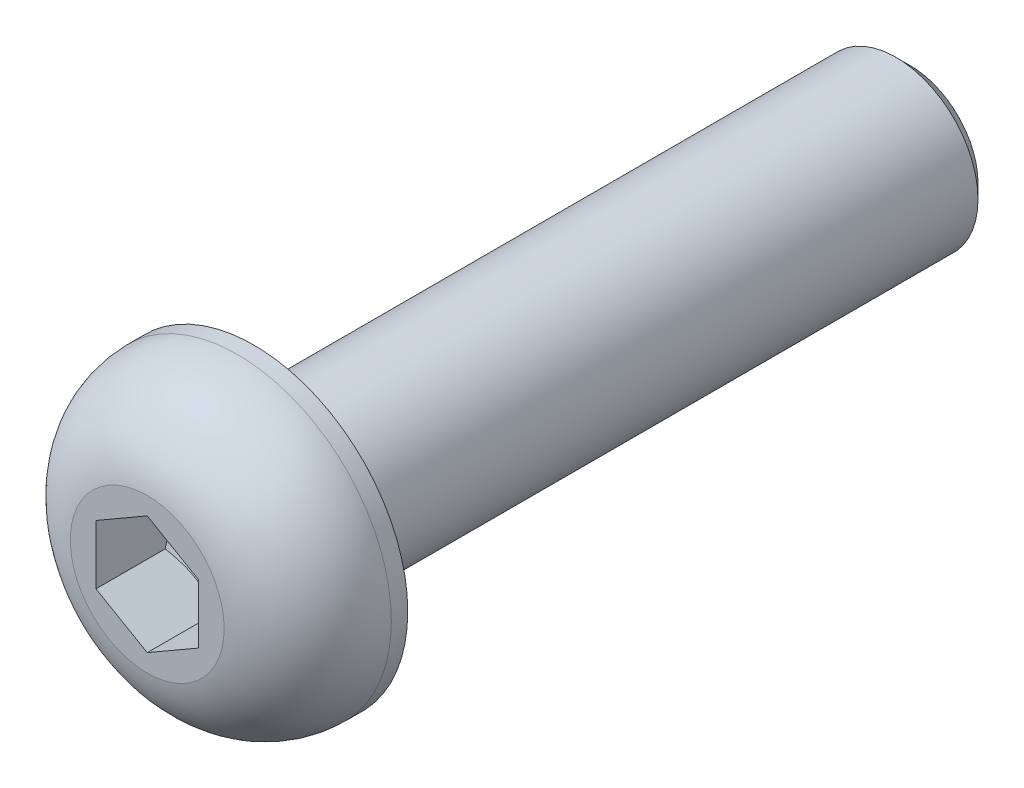
ISO-10303-21;
HEADER;
FILE_DESCRIPTION(('STEP AP214'),'2;1');
FILE_NAME('part.step','',(''),(''),'','','');
FILE_SCHEMA(('AUTOMOTIVE_DESIGN { 1 0 10303 214 1 1 1 1 }'));
ENDSEC;
DATA;
#1=APPLICATION_CONTEXT('core data for automotive mechanical design processes');
#2=APPLICATION_PROTOCOL_DEFINITION('international standard','automotive_design',2000,#1);
#3=PRODUCT_CONTEXT('',#1,'mechanical');
#4=PRODUCT('Part','Part','',(#3));
#5=PRODUCT_RELATED_PRODUCT_CATEGORY('part','',(#4));
#6=PRODUCT_DEFINITION_FORMATION('','',#4);
#7=PRODUCT_DEFINITION_CONTEXT('part definition',#1,'design');
#8=PRODUCT_DEFINITION('design','',#6,#7);
#9=PRODUCT_DEFINITION_SHAPE('','',#8);
#10=(LENGTH_UNIT() NAMED_UNIT(*) SI_UNIT(.MILLI.,.METRE.));
#11=(NAMED_UNIT(*) PLANE_ANGLE_UNIT() SI_UNIT($,.RADIAN.));
#12=(NAMED_UNIT(*) SI_UNIT($,.STERADIAN.) SOLID_ANGLE_UNIT());
#13=UNCERTAINTY_MEASURE_WITH_UNIT(LENGTH_MEASURE(1.E-05),#10,'distance_accuracy_value','');
#14=(GEOMETRIC_REPRESENTATION_CONTEXT(3) GLOBAL_UNCERTAINTY_ASSIGNED_CONTEXT((#13)) GLOBAL_UNIT_ASSIGNED_CONTEXT((#10,
#11,#12)) REPRESENTATION_CONTEXT('',''));
#15=CARTESIAN_POINT('',(0.,0.,0.));
#16=DIRECTION('',(0.,0.,1.));
#17=DIRECTION('',(1.,0.,0.));
#18=AXIS2_PLACEMENT_3D('',#15,#16,#17);
#19=CARTESIAN_POINT('',(0.,1.875,2.6));
#20=DIRECTION('',(0.,0.,-1.));
#21=DIRECTION('',(-1.,0.,0.));
#22=AXIS2_PLACEMENT_3D('',#19,#20,#21);
#23=PLANE('',#22);
#24=CARTESIAN_POINT('',(0.,0.,2.6));
#25=DIRECTION('',(0.,0.,1.));
#26=DIRECTION('',(1.,0.,0.));
#27=AXIS2_PLACEMENT_3D('',#24,#25,#26);
#28=CIRCLE('',#27,1.875);
#29=CARTESIAN_POINT('',(1.875,0.,2.6));
#30=VERTEX_POINT('',#29);
#31=EDGE_CURVE('E140',#30,#30,#28,.T.);
#32=ORIENTED_EDGE('',*,*,#31,.T.);
#33=EDGE_LOOP('',(#32));
#34=FACE_BOUND('',#33,.T.);
#35=DIRECTION('',(-0.866025403784438,-0.5,0.));
#36=VECTOR('',#35,1.);
#37=CARTESIAN_POINT('',(0.,1.44337567297406,2.6));
#38=LINE('',#37,#36);
#39=CARTESIAN_POINT('',(0.,1.44337567297406,2.6));
#40=VERTEX_POINT('',#39);
#41=CARTESIAN_POINT('',(-1.25,0.721687836487031,2.6));
#42=VERTEX_POINT('',#41);
#43=EDGE_CURVE('E92',#40,#42,#38,.T.);
#44=ORIENTED_EDGE('',*,*,#43,.F.);
#45=DIRECTION('',(-0.866025403784439,0.5,0.));
#46=VECTOR('',#45,1.);
#47=CARTESIAN_POINT('',(1.25,0.721687836487032,2.6));
#48=LINE('',#47,#46);
#49=CARTESIAN_POINT('',(1.25,0.721687836487032,2.6));
#50=VERTEX_POINT('',#49);
#51=EDGE_CURVE('E52',#50,#40,#48,.T.);
#52=ORIENTED_EDGE('',*,*,#51,.F.);
#53=DIRECTION('',(0.,1.,0.));
#54=VECTOR('',#53,1.);
#55=CARTESIAN_POINT('',(1.25,-0.721687836487032,2.6));
#56=LINE('',#55,#54);
#57=CARTESIAN_POINT('',(1.25,-0.721687836487032,2.6));
#58=VERTEX_POINT('',#57);
#59=EDGE_CURVE('E120',#58,#50,#56,.T.);
#60=ORIENTED_EDGE('',*,*,#59,.F.);
#61=DIRECTION('',(0.866025403784438,0.5,0.));
#62=VECTOR('',#61,1.);
#63=CARTESIAN_POINT('',(0.,-1.44337567297406,2.6));
#64=LINE('',#63,#62);
#65=CARTESIAN_POINT('',(0.,-1.44337567297406,2.6));
#66=VERTEX_POINT('',#65);
#67=EDGE_CURVE('E114',#66,#58,#64,.T.);
#68=ORIENTED_EDGE('',*,*,#67,.F.);
#69=DIRECTION('',(0.866025403784439,-0.5,0.));
#70=VECTOR('',#69,1.);
#71=CARTESIAN_POINT('',(-1.25,-0.721687836487031,2.6));
#72=LINE('',#71,#70);
#73=CARTESIAN_POINT('',(-1.25,-0.721687836487031,2.6));
#74=VERTEX_POINT('',#73);
#75=EDGE_CURVE('E112',#74,#66,#72,.T.);
#76=ORIENTED_EDGE('',*,*,#75,.F.);
#77=DIRECTION('',(0.,-1.,0.));
#78=VECTOR('',#77,1.);
#79=CARTESIAN_POINT('',(-1.25,0.721687836487031,2.6));
#80=LINE('',#79,#78);
#81=EDGE_CURVE('E100',#42,#74,#80,.T.);
#82=ORIENTED_EDGE('',*,*,#81,.F.);
#83=EDGE_LOOP('',(#44,#52,#60,#68,#76,#82));
#84=FACE_BOUND('',#83,.T.);
#85=ADVANCED_FACE('F37',(#34,#84),#23,.F.);
#86=CARTESIAN_POINT('',(0.,0.,-16.));
#87=DIRECTION('',(0.,0.,1.));
#88=DIRECTION('',(1.,0.,0.));
#89=AXIS2_PLACEMENT_3D('',#86,#87,#88);
#90=PLANE('',#89);
#91=CARTESIAN_POINT('',(0.,0.,-16.));
#92=DIRECTION('',(0.,0.,1.));
#93=DIRECTION('',(1.,0.,0.));
#94=AXIS2_PLACEMENT_3D('',#91,#92,#93);
#95=CIRCLE('',#94,1.65000000000001);
#96=CARTESIAN_POINT('',(1.65000000000001,0.,-16.));
#97=VERTEX_POINT('',#96);
#98=EDGE_CURVE('E231',#97,#97,#95,.F.);
#99=ORIENTED_EDGE('',*,*,#98,.T.);
#100=EDGE_LOOP('',(#99));
#101=FACE_BOUND('',#100,.T.);
#102=ADVANCED_FACE('F209',(#101),#90,.F.);
#103=CARTESIAN_POINT('',(0.,0.,30.8099697885196));
#104=DIRECTION('',(0.,0.,1.));
#105=DIRECTION('',(1.,0.,0.));
#106=AXIS2_PLACEMENT_3D('',#103,#104,#105);
#107=CYLINDRICAL_SURFACE('',#106,2.);
#108=CARTESIAN_POINT('',(0.,0.,-0.199999999999999));
#109=DIRECTION('',(0.,0.,1.));
#110=DIRECTION('',(1.,0.,0.));
#111=AXIS2_PLACEMENT_3D('',#108,#109,#110);
#112=CIRCLE('',#111,2.);
#113=CARTESIAN_POINT('',(2.,0.,-0.199999999999999));
#114=VERTEX_POINT('',#113);
#115=EDGE_CURVE('E11',#114,#114,#112,.F.);
#116=ORIENTED_EDGE('',*,*,#115,.T.);
#117=EDGE_LOOP('',(#116));
#118=FACE_BOUND('',#117,.T.);
#119=CARTESIAN_POINT('',(0.,0.,-15.65));
#120=DIRECTION('',(0.,0.,1.));
#121=DIRECTION('',(1.,0.,0.));
#122=AXIS2_PLACEMENT_3D('',#119,#120,#121);
#123=CIRCLE('',#122,2.);
#124=CARTESIAN_POINT('',(2.,0.,-15.65));
#125=VERTEX_POINT('',#124);
#126=EDGE_CURVE('E226',#125,#125,#123,.T.);
#127=ORIENTED_EDGE('',*,*,#126,.T.);
#128=EDGE_LOOP('',(#127));
#129=FACE_BOUND('',#128,.T.);
#130=ADVANCED_FACE('F214',(#118,#129),#107,.T.);
#131=CARTESIAN_POINT('',(0.,2.,0.));
#132=DIRECTION('',(0.,0.,1.));
#133=DIRECTION('',(1.,0.,0.));
#134=AXIS2_PLACEMENT_3D('',#131,#132,#133);
#135=PLANE('',#134);
#136=CARTESIAN_POINT('',(0.,0.,0.));
#137=DIRECTION('',(0.,0.,1.));
#138=DIRECTION('',(1.,0.,0.));
#139=AXIS2_PLACEMENT_3D('',#136,#137,#138);
#140=CIRCLE('',#139,2.2);
#141=CARTESIAN_POINT('',(2.2,0.,0.));
#142=VERTEX_POINT('',#141);
#143=EDGE_CURVE('E45',#142,#142,#140,.T.);
#144=ORIENTED_EDGE('',*,*,#143,.T.);
#145=EDGE_LOOP('',(#144));
#146=FACE_BOUND('',#145,.T.);
#147=CARTESIAN_POINT('',(0.,0.,0.));
#148=DIRECTION('',(0.,0.,1.));
#149=DIRECTION('',(1.,0.,0.));
#150=AXIS2_PLACEMENT_3D('',#147,#148,#149);
#151=CIRCLE('',#150,3.75);
#152=CARTESIAN_POINT('',(3.75,0.,0.));
#153=VERTEX_POINT('',#152);
#154=EDGE_CURVE('E222',#153,#153,#151,.T.);
#155=ORIENTED_EDGE('',*,*,#154,.F.);
#156=EDGE_LOOP('',(#155));
#157=FACE_BOUND('',#156,.T.);
#158=ADVANCED_FACE('F236',(#146,#157),#135,.F.);
#159=CARTESIAN_POINT('',(0.,0.,30.8099697885196));
#160=DIRECTION('',(0.,0.,1.));
#161=DIRECTION('',(1.,0.,0.));
#162=AXIS2_PLACEMENT_3D('',#159,#160,#161);
#163=CYLINDRICAL_SURFACE('',#162,3.75);
#164=CARTESIAN_POINT('',(0.,0.,0.400000000000001));
#165=DIRECTION('',(0.,0.,1.));
#166=DIRECTION('',(1.,0.,0.));
#167=AXIS2_PLACEMENT_3D('',#164,#165,#166);
#168=CIRCLE('',#167,3.75);
#169=CARTESIAN_POINT('',(3.75,0.,0.400000000000001));
#170=VERTEX_POINT('',#169);
#171=EDGE_CURVE('E220',#170,#170,#168,.T.);
#172=ORIENTED_EDGE('',*,*,#171,.F.);
#173=EDGE_LOOP('',(#172));
#174=FACE_BOUND('',#173,.T.);
#175=ORIENTED_EDGE('',*,*,#154,.T.);
#176=EDGE_LOOP('',(#175));
#177=FACE_BOUND('',#176,.T.);
#178=ADVANCED_FACE('F258',(#174,#177),#163,.T.);
#179=CARTESIAN_POINT('',(0.,0.,0.4));
#180=DIRECTION('',(0.,0.,1.));
#181=DIRECTION('',(1.,0.,0.));
#182=AXIS2_PLACEMENT_3D('',#179,#180,#181);
#183=DEGENERATE_TOROIDAL_SURFACE('',#182,1.52183333333333,2.22816666666667,.T.);
#184=ORIENTED_EDGE('',*,*,#31,.F.);
#185=EDGE_LOOP('',(#184));
#186=FACE_BOUND('',#185,.T.);
#187=ORIENTED_EDGE('',*,*,#171,.T.);
#188=EDGE_LOOP('',(#187));
#189=FACE_BOUND('',#188,.T.);
#190=ADVANCED_FACE('F252',(#186,#189),#183,.T.);
#191=CARTESIAN_POINT('',(0.,0.,-15.65));
#192=DIRECTION('',(0.,0.,1.));
#193=DIRECTION('',(1.,0.,0.));
#194=AXIS2_PLACEMENT_3D('',#191,#192,#193);
#195=CONICAL_SURFACE('',#194,2.,0.785398163397454);
#196=ORIENTED_EDGE('',*,*,#98,.F.);
#197=EDGE_LOOP('',(#196));
#198=FACE_BOUND('',#197,.T.);
#199=ORIENTED_EDGE('',*,*,#126,.F.);
#200=EDGE_LOOP('',(#199));
#201=FACE_BOUND('',#200,.T.);
#202=ADVANCED_FACE('F250',(#198,#201),#195,.T.);
#203=CARTESIAN_POINT('',(1.25,0.721687836487032,-16.001));
#204=DIRECTION('',(0.5,0.866025403784439,0.));
#205=DIRECTION('',(-0.866025403784439,0.5,0.));
#206=AXIS2_PLACEMENT_3D('',#203,#204,#205);
#207=PLANE('',#206);
#208=CARTESIAN_POINT('',(-0.000199999999999732,1.4434911430279,0.91171217151233));
#209=CARTESIAN_POINT('',(0.0547333052317656,1.41177538446487,0.893391411609993));
#210=CARTESIAN_POINT('',(0.11014078650024,1.37978586023939,0.87672880304694));
#211=CARTESIAN_POINT('',(0.22191536760034,1.31525277575269,0.847642800792072));
#212=CARTESIAN_POINT('',(0.278284454841711,1.28270806805991,0.835229698822352));
#213=CARTESIAN_POINT('',(0.390323974086985,1.21802202146378,0.815905184482314));
#214=CARTESIAN_POINT('',(0.44597715845923,1.1858906404852,0.808865186293734));
#215=CARTESIAN_POINT('',(0.557545653908392,1.12147653960455,0.800457929476935));
#216=CARTESIAN_POINT('',(0.613460558937601,1.08919405413422,0.799083712051026));
#217=CARTESIAN_POINT('',(0.717957921181726,1.02886247391297,0.801928834214222));
#218=CARTESIAN_POINT('',(0.766555949881316,1.00080438896118,0.805449595666318));
#219=CARTESIAN_POINT('',(0.863435362173239,0.944871034195503,0.816612609545558));
#220=CARTESIAN_POINT('',(0.911716410192164,0.916995958125019,0.82425868241898));
#221=CARTESIAN_POINT('',(1.00879588385404,0.860947097873546,0.843374951546834));
#222=CARTESIAN_POINT('',(1.0575820103519,0.83278041460729,0.85492625382596));
#223=CARTESIAN_POINT('',(1.1544262522921,0.776867365453648,0.881143811540195));
#224=CARTESIAN_POINT('',(1.20248561032696,0.74912028215514,0.895803898985409));
#225=CARTESIAN_POINT('',(1.2502,0.721572366433195,0.91171217151233));
#226=B_SPLINE_CURVE_WITH_KNOTS('',3,(#208,#209,#210,#211,#212,#213,#214,#215,#216,#217,#218,
#219,#220,#221,#222,#223,#224,#225),.UNSPECIFIED.,.F.,.F.,(4,2,2,2,2,2,2,2,4),(0.,
0.19815082102956,0.396778196315222,0.590488617354401,0.783961049317183,0.952480056398647,
1.1211553973001,1.2935743034359,1.4656542697693),.UNSPECIFIED.);
#227=CARTESIAN_POINT('',(0.,1.44337567297406,0.911645496846304));
#228=VERTEX_POINT('',#227);
#229=CARTESIAN_POINT('',(1.25,0.721687836487032,0.911645496846304));
#230=VERTEX_POINT('',#229);
#231=EDGE_CURVE('E141',#228,#230,#226,.T.);
#232=ORIENTED_EDGE('',*,*,#231,.T.);
#233=DIRECTION('',(0.,0.,1.));
#234=VECTOR('',#233,1.);
#235=CARTESIAN_POINT('',(1.25,0.721687836487032,-16.001));
#236=LINE('',#235,#234);
#237=EDGE_CURVE('E122',#230,#50,#236,.T.);
#238=ORIENTED_EDGE('',*,*,#237,.T.);
#239=ORIENTED_EDGE('',*,*,#51,.T.);
#240=DIRECTION('',(0.,0.,1.));
#241=VECTOR('',#240,1.);
#242=CARTESIAN_POINT('',(0.,1.44337567297406,-16.001));
#243=LINE('',#242,#241);
#244=EDGE_CURVE('E97',#228,#40,#243,.T.);
#245=ORIENTED_EDGE('',*,*,#244,.F.);
#246=EDGE_LOOP('',(#232,#238,#239,#245));
#247=FACE_BOUND('',#246,.T.);
#248=ADVANCED_FACE('F151',(#247),#207,.F.);
#249=CARTESIAN_POINT('',(1.25,-0.721687836487032,-16.001));
#250=DIRECTION('',(1.,0.,0.));
#251=DIRECTION('',(0.,1.,0.));
#252=AXIS2_PLACEMENT_3D('',#249,#250,#251);
#253=PLANE('',#252);
#254=CARTESIAN_POINT('',(1.25,-1.96105474344206,1.42097564912365));
#255=CARTESIAN_POINT('',(1.25,-1.90623430927119,1.39429259623348));
#256=CARTESIAN_POINT('',(1.25,-1.85129028178163,1.36785972321338));
#257=CARTESIAN_POINT('',(1.25,-1.74108952475517,1.31563306560225));
#258=CARTESIAN_POINT('',(1.25,-1.68583274940503,1.2898393777842));
#259=CARTESIAN_POINT('',(1.25,-1.57466736261181,1.23890502395825));
#260=CARTESIAN_POINT('',(1.25,-1.51875685330655,1.21376848119652));
#261=CARTESIAN_POINT('',(1.25,-1.40649796790756,1.16450056450348));
#262=CARTESIAN_POINT('',(1.25,-1.35014961209464,1.14036914434089));
#263=CARTESIAN_POINT('',(1.25,-1.17665045773962,1.0683179276951));
#264=CARTESIAN_POINT('',(1.25,-1.05864305156987,1.02242757330278));
#265=CARTESIAN_POINT('',(1.25,-0.819657773634106,0.939560417752094));
#266=CARTESIAN_POINT('',(1.25,-0.698687180977714,0.90256379802043));
#267=CARTESIAN_POINT('',(1.25,-0.514847741035732,0.858166681636453));
#268=CARTESIAN_POINT('',(1.25,-0.453332207901061,0.845236442395282));
#269=CARTESIAN_POINT('',(1.25,-0.329512056252197,0.823874263664754));
#270=CARTESIAN_POINT('',(1.25,-0.267207531424365,0.815441795135015));
#271=CARTESIAN_POINT('',(1.25,-0.142941091529237,0.80385371506625));
#272=CARTESIAN_POINT('',(1.25,-0.0809858304717168,0.800628689099913));
#273=CARTESIAN_POINT('',(1.25,0.0429730846440799,0.799538151833025));
#274=CARTESIAN_POINT('',(1.25,0.104976740751501,0.801672881331512));
#275=CARTESIAN_POINT('',(1.25,0.252294037554042,0.812929693233274));
#276=CARTESIAN_POINT('',(1.25,0.337427848878579,0.824417508202584));
#277=CARTESIAN_POINT('',(1.25,0.506212079393454,0.855550532557533));
#278=CARTESIAN_POINT('',(1.25,0.589860792939887,0.875204559405284));
#279=CARTESIAN_POINT('',(1.25,0.715099058752615,0.909470753081495));
#280=CARTESIAN_POINT('',(1.25,0.757318989267002,0.921872132798684));
#281=CARTESIAN_POINT('',(1.25,0.841321195262639,0.947999640846473));
#282=CARTESIAN_POINT('',(1.25,0.883103713106104,0.961724987254457));
#283=CARTESIAN_POINT('',(1.25,0.966283159844529,0.990285259833847));
#284=CARTESIAN_POINT('',(1.25,1.0076801028148,1.00512014532189));
#285=CARTESIAN_POINT('',(1.25,1.09013339511368,1.03572121379833));
#286=CARTESIAN_POINT('',(1.25,1.13118969739057,1.0514875230774));
#287=CARTESIAN_POINT('',(1.25,1.26833471364453,1.1056415080992));
#288=CARTESIAN_POINT('',(1.25,1.36373294708307,1.14577705605669));
#289=CARTESIAN_POINT('',(1.25,1.55329254626844,1.22888226735697));
#290=CARTESIAN_POINT('',(1.25,1.64745362339173,1.27185257843871));
#291=CARTESIAN_POINT('',(1.25,1.83491007472554,1.35977053150484));
#292=CARTESIAN_POINT('',(1.25,1.92820492487841,1.40471928663467));
#293=CARTESIAN_POINT('',(1.25,2.11411230875433,1.4960095463212));
#294=CARTESIAN_POINT('',(1.25,2.20672481279689,1.54235111102176));
#295=CARTESIAN_POINT('',(1.25,2.48423466522565,1.68309752552789));
#296=CARTESIAN_POINT('',(1.25,2.66836433611267,1.77901280491505));
#297=CARTESIAN_POINT('',(1.25,3.03534141253052,1.97308363705619));
#298=CARTESIAN_POINT('',(1.25,3.21818926836535,2.07123834561345));
#299=CARTESIAN_POINT('',(1.25,3.55642364131695,2.25453020514237));
#300=CARTESIAN_POINT('',(1.25,3.71191606943591,2.33947211932393));
#301=CARTESIAN_POINT('',(1.25,4.02251221427384,2.51010369110127));
#302=CARTESIAN_POINT('',(1.25,4.17761588538224,2.59579343159282));
#303=CARTESIAN_POINT('',(1.25,4.48685386706873,2.76733439630878));
#304=CARTESIAN_POINT('',(1.25,4.64098946304764,2.85318330530833));
#305=CARTESIAN_POINT('',(1.25,4.94901514609735,3.02527605344198));
#306=CARTESIAN_POINT('',(1.25,5.1029052611118,3.11151984254451));
#307=CARTESIAN_POINT('',(1.25,5.25671599569771,3.19790418061096));
#308=B_SPLINE_CURVE_WITH_KNOTS('',3,(#254,#255,#256,#257,#258,#259,#260,#261,#262,#263,#264,
#265,#266,#267,#268,#269,#270,#271,#272,#273,#274,#275,#276,#277,#278,#279,#280,#281,#282,#283,
#284,#285,#286,#287,#288,#289,#290,#291,#292,#293,#294,#295,#296,#297,#298,#299,#300,#301,#302,
#303,#304,#305,#306,#307),.UNSPECIFIED.,.F.,.F.,(4,2,2,2,2,2,2,2,2,2,2,2,2,2,2,2,2,2,2,2,2,2,2,
2,2,2,4),(0.,0.18290984688699,0.365847219289996,0.54974183185338,0.733627976700977,
1.11331025365342,1.49213844613905,1.68058392586945,1.86900723522428,2.05489751384174,
2.24079614414642,2.49798836542827,2.75545901449846,2.88745299844529,3.01936949975063,
3.15128116645577,3.28321076014453,3.59362061287693,3.904101641108,4.21475964801354,
4.5254310889839,5.14823794575227,5.77081378066878,6.30235308128087,6.83395207039833,
7.36324370393337,7.89247003570512),.UNSPECIFIED.);
#309=CARTESIAN_POINT('',(1.25,-0.721687836487032,0.911645496846304));
#310=VERTEX_POINT('',#309);
#311=EDGE_CURVE('E180',#230,#310,#308,.F.);
#312=ORIENTED_EDGE('',*,*,#311,.T.);
#313=DIRECTION('',(0.,0.,1.));
#314=VECTOR('',#313,1.);
#315=CARTESIAN_POINT('',(1.25,-0.721687836487032,-16.001));
#316=LINE('',#315,#314);
#317=EDGE_CURVE('E124',#310,#58,#316,.T.);
#318=ORIENTED_EDGE('',*,*,#317,.T.);
#319=ORIENTED_EDGE('',*,*,#59,.T.);
#320=ORIENTED_EDGE('',*,*,#237,.F.);
#321=EDGE_LOOP('',(#312,#318,#319,#320));
#322=FACE_BOUND('',#321,.T.);
#323=ADVANCED_FACE('F191',(#322),#253,.F.);
#324=CARTESIAN_POINT('',(0.,-1.44337567297406,-16.001));
#325=DIRECTION('',(0.5,-0.866025403784438,0.));
#326=DIRECTION('',(0.866025403784439,0.5,0.));
#327=AXIS2_PLACEMENT_3D('',#324,#325,#326);
#328=PLANE('',#327);
#329=CARTESIAN_POINT('',(1.2502,-0.721572366433194,0.91171217151233));
#330=CARTESIAN_POINT('',(1.19526669476823,-0.75328812499623,0.893391411609993));
#331=CARTESIAN_POINT('',(1.13985921349976,-0.785277649221703,0.87672880304694));
#332=CARTESIAN_POINT('',(1.02808463239966,-0.849810733708404,0.847642800792072));
#333=CARTESIAN_POINT('',(0.971715545158289,-0.882355441401182,0.835229698822352));
#334=CARTESIAN_POINT('',(0.859676025913015,-0.947041487997317,0.815905184482314));
#335=CARTESIAN_POINT('',(0.80402284154077,-0.979172868975893,0.808865186293734));
#336=CARTESIAN_POINT('',(0.692454346091608,-1.04358696985655,0.800457929476936));
#337=CARTESIAN_POINT('',(0.636539441062399,-1.07586945532687,0.799083712051027));
#338=CARTESIAN_POINT('',(0.532042078818274,-1.13620103554813,0.801928834214222));
#339=CARTESIAN_POINT('',(0.483444050118684,-1.16425912049992,0.805449595666318));
#340=CARTESIAN_POINT('',(0.386564637826762,-1.22019247526559,0.816612609545558));
#341=CARTESIAN_POINT('',(0.338283589807837,-1.24806755133608,0.82425868241898));
#342=CARTESIAN_POINT('',(0.241204116145957,-1.30411641158755,0.843374951546834));
#343=CARTESIAN_POINT('',(0.192417989648101,-1.33228309485381,0.85492625382596));
#344=CARTESIAN_POINT('',(0.0955737477078991,-1.38819614400745,0.881143811540195));
#345=CARTESIAN_POINT('',(0.0475143896730371,-1.41594322730596,0.895803898985409));
#346=CARTESIAN_POINT('',(-0.000199999999998498,-1.4434911430279,0.91171217151233));
#347=B_SPLINE_CURVE_WITH_KNOTS('',3,(#329,#330,#331,#332,#333,#334,#335,#336,#337,#338,#339,
#340,#341,#342,#343,#344,#345,#346),.UNSPECIFIED.,.F.,.F.,(4,2,2,2,2,2,2,2,4),(0.,
0.19815082102956,0.396778196315222,0.590488617354401,0.783961049317183,0.952480056398647,
1.1211553973001,1.2935743034359,1.4656542697693),.UNSPECIFIED.);
#348=CARTESIAN_POINT('',(0.,-1.44337567297406,0.911645496846304));
#349=VERTEX_POINT('',#348);
#350=EDGE_CURVE('E173',#310,#349,#347,.T.);
#351=ORIENTED_EDGE('',*,*,#350,.T.);
#352=DIRECTION('',(0.,0.,1.));
#353=VECTOR('',#352,1.);
#354=CARTESIAN_POINT('',(0.,-1.44337567297406,-16.001));
#355=LINE('',#354,#353);
#356=EDGE_CURVE('E127',#349,#66,#355,.T.);
#357=ORIENTED_EDGE('',*,*,#356,.T.);
#358=ORIENTED_EDGE('',*,*,#67,.T.);
#359=ORIENTED_EDGE('',*,*,#317,.F.);
#360=EDGE_LOOP('',(#351,#357,#358,#359));
#361=FACE_BOUND('',#360,.T.);
#362=ADVANCED_FACE('F194',(#361),#328,.F.);
#363=CARTESIAN_POINT('',(-1.25,-0.721687836487031,-16.001));
#364=DIRECTION('',(-0.5,-0.866025403784439,0.));
#365=DIRECTION('',(0.866025403784439,-0.5,0.));
#366=AXIS2_PLACEMENT_3D('',#363,#364,#365);
#367=PLANE('',#366);
#368=CARTESIAN_POINT('',(0.000200000000001263,-1.4434911430279,0.91171217151233));
#369=CARTESIAN_POINT('',(-0.0547333052317639,-1.41177538446487,0.893391411609993));
#370=CARTESIAN_POINT('',(-0.110140786500239,-1.37978586023939,0.87672880304694));
#371=CARTESIAN_POINT('',(-0.221915367600339,-1.31525277575269,0.847642800792072));
#372=CARTESIAN_POINT('',(-0.278284454841709,-1.28270806805991,0.835229698822352));
#373=CARTESIAN_POINT('',(-0.390323974086984,-1.21802202146378,0.815905184482314));
#374=CARTESIAN_POINT('',(-0.445977158459229,-1.1858906404852,0.808865186293734));
#375=CARTESIAN_POINT('',(-0.557545653908391,-1.12147653960455,0.800457929476935));
#376=CARTESIAN_POINT('',(-0.6134605589376,-1.08919405413422,0.799083712051026));
#377=CARTESIAN_POINT('',(-0.717957921181725,-1.02886247391297,0.801928834214222));
#378=CARTESIAN_POINT('',(-0.766555949881315,-1.00080438896118,0.805449595666318));
#379=CARTESIAN_POINT('',(-0.863435362173238,-0.944871034195503,0.816612609545558));
#380=CARTESIAN_POINT('',(-0.911716410192163,-0.916995958125019,0.824258682418979));
#381=CARTESIAN_POINT('',(-1.00879588385404,-0.860947097873546,0.843374951546834));
#382=CARTESIAN_POINT('',(-1.0575820103519,-0.832780414607289,0.85492625382596));
#383=CARTESIAN_POINT('',(-1.1544262522921,-0.776867365453648,0.881143811540195));
#384=CARTESIAN_POINT('',(-1.20248561032696,-0.74912028215514,0.895803898985409));
#385=CARTESIAN_POINT('',(-1.2502,-0.721572366433194,0.91171217151233));
#386=B_SPLINE_CURVE_WITH_KNOTS('',3,(#368,#369,#370,#371,#372,#373,#374,#375,#376,#377,#378,
#379,#380,#381,#382,#383,#384,#385),.UNSPECIFIED.,.F.,.F.,(4,2,2,2,2,2,2,2,4),(0.,
0.19815082102956,0.396778196315221,0.590488617354401,0.783961049317183,0.952480056398648,
1.1211553973001,1.2935743034359,1.46565426976931),.UNSPECIFIED.);
#387=CARTESIAN_POINT('',(-1.25,-0.721687836487111,0.911645496846251));
#388=VERTEX_POINT('',#387);
#389=EDGE_CURVE('E166',#349,#388,#386,.T.);
#390=ORIENTED_EDGE('',*,*,#389,.T.);
#391=DIRECTION('',(0.,0.,1.));
#392=VECTOR('',#391,1.);
#393=CARTESIAN_POINT('',(-1.25,-0.721687836487031,-16.001));
#394=LINE('',#393,#392);
#395=EDGE_CURVE('E108',#388,#74,#394,.T.);
#396=ORIENTED_EDGE('',*,*,#395,.T.);
#397=ORIENTED_EDGE('',*,*,#75,.T.);
#398=ORIENTED_EDGE('',*,*,#356,.F.);
#399=EDGE_LOOP('',(#390,#396,#397,#398));
#400=FACE_BOUND('',#399,.T.);
#401=ADVANCED_FACE('F198',(#400),#367,.F.);
#402=CARTESIAN_POINT('',(-1.25,0.721687836487031,-16.001));
#403=DIRECTION('',(-1.,0.,0.));
#404=DIRECTION('',(0.,-1.,0.));
#405=AXIS2_PLACEMENT_3D('',#402,#403,#404);
#406=PLANE('',#405);
#407=CARTESIAN_POINT('',(-1.25,-1.96105474344206,1.42097564912365));
#408=CARTESIAN_POINT('',(-1.25,-1.90623430927119,1.39429259623348));
#409=CARTESIAN_POINT('',(-1.25,-1.85129028178163,1.36785972321338));
#410=CARTESIAN_POINT('',(-1.25,-1.74108952475517,1.31563306560225));
#411=CARTESIAN_POINT('',(-1.25,-1.68583274940503,1.2898393777842));
#412=CARTESIAN_POINT('',(-1.25,-1.57466736261181,1.23890502395825));
#413=CARTESIAN_POINT('',(-1.25,-1.51875685330655,1.21376848119652));
#414=CARTESIAN_POINT('',(-1.25,-1.40649796790756,1.16450056450348));
#415=CARTESIAN_POINT('',(-1.25,-1.35014961209464,1.14036914434089));
#416=CARTESIAN_POINT('',(-1.25,-1.17665045773962,1.0683179276951));
#417=CARTESIAN_POINT('',(-1.25,-1.05864305156987,1.02242757330278));
#418=CARTESIAN_POINT('',(-1.25,-0.819657773634105,0.939560417752094));
#419=CARTESIAN_POINT('',(-1.25,-0.698687180977713,0.90256379802043));
#420=CARTESIAN_POINT('',(-1.25,-0.514847741035731,0.858166681636453));
#421=CARTESIAN_POINT('',(-1.25,-0.45333220790106,0.845236442395282));
#422=CARTESIAN_POINT('',(-1.25,-0.329512056252196,0.823874263664755));
#423=CARTESIAN_POINT('',(-1.25,-0.267207531424364,0.815441795135015));
#424=CARTESIAN_POINT('',(-1.25,-0.142941091529236,0.80385371506625));
#425=CARTESIAN_POINT('',(-1.25,-0.0809858304717161,0.800628689099913));
#426=CARTESIAN_POINT('',(-1.25,0.0429730846440806,0.799538151833026));
#427=CARTESIAN_POINT('',(-1.25,0.104976740751501,0.801672881331513));
#428=CARTESIAN_POINT('',(-1.25,0.252294037554043,0.812929693233274));
#429=CARTESIAN_POINT('',(-1.25,0.33742784887858,0.824417508202584));
#430=CARTESIAN_POINT('',(-1.25,0.506212079393455,0.855550532557534));
#431=CARTESIAN_POINT('',(-1.25,0.589860792939888,0.875204559405285));
#432=CARTESIAN_POINT('',(-1.25,0.715099058752616,0.909470753081496));
#433=CARTESIAN_POINT('',(-1.25,0.757318989267003,0.921872132798685));
#434=CARTESIAN_POINT('',(-1.25,0.841321195262641,0.947999640846473));
#435=CARTESIAN_POINT('',(-1.25,0.883103713106105,0.961724987254457));
#436=CARTESIAN_POINT('',(-1.25,0.96628315984453,0.990285259833848));
#437=CARTESIAN_POINT('',(-1.25,1.0076801028148,1.0051201453219));
#438=CARTESIAN_POINT('',(-1.25,1.09013339511368,1.03572121379833));
#439=CARTESIAN_POINT('',(-1.25,1.13118969739057,1.0514875230774));
#440=CARTESIAN_POINT('',(-1.25,1.26833471364453,1.1056415080992));
#441=CARTESIAN_POINT('',(-1.25,1.36373294708307,1.14577705605669));
#442=CARTESIAN_POINT('',(-1.25,1.55329254626844,1.22888226735697));
#443=CARTESIAN_POINT('',(-1.25,1.64745362339173,1.27185257843871));
#444=CARTESIAN_POINT('',(-1.25,1.83491007472554,1.35977053150484));
#445=CARTESIAN_POINT('',(-1.25,1.92820492487841,1.40471928663467));
#446=CARTESIAN_POINT('',(-1.25,2.11411230875433,1.4960095463212));
#447=CARTESIAN_POINT('',(-1.25,2.20672481279689,1.54235111102176));
#448=CARTESIAN_POINT('',(-1.25,2.48423466522565,1.6830975255279));
#449=CARTESIAN_POINT('',(-1.25,2.66836433611267,1.77901280491505));
#450=CARTESIAN_POINT('',(-1.25,3.03534141253052,1.97308363705619));
#451=CARTESIAN_POINT('',(-1.25,3.21818926836536,2.07123834561346));
#452=CARTESIAN_POINT('',(-1.25,3.55642364131696,2.25453020514237));
#453=CARTESIAN_POINT('',(-1.25,3.71191606943591,2.33947211932393));
#454=CARTESIAN_POINT('',(-1.25,4.02251221427385,2.51010369110127));
#455=CARTESIAN_POINT('',(-1.25,4.17761588538225,2.59579343159282));
#456=CARTESIAN_POINT('',(-1.25,4.48685386706873,2.76733439630878));
#457=CARTESIAN_POINT('',(-1.25,4.64098946304765,2.85318330530833));
#458=CARTESIAN_POINT('',(-1.25,4.94901514609736,3.02527605344198));
#459=CARTESIAN_POINT('',(-1.25,5.10290526111181,3.11151984254452));
#460=CARTESIAN_POINT('',(-1.25,5.25671599569771,3.19790418061097));
#461=B_SPLINE_CURVE_WITH_KNOTS('',3,(#407,#408,#409,#410,#411,#412,#413,#414,#415,#416,#417,
#418,#419,#420,#421,#422,#423,#424,#425,#426,#427,#428,#429,#430,#431,#432,#433,#434,#435,#436,
#437,#438,#439,#440,#441,#442,#443,#444,#445,#446,#447,#448,#449,#450,#451,#452,#453,#454,#455,
#456,#457,#458,#459,#460),.UNSPECIFIED.,.F.,.F.,(4,2,2,2,2,2,2,2,2,2,2,2,2,2,2,2,2,2,2,2,2,2,2,
2,2,2,4),(0.,0.18290984688699,0.365847219289996,0.54974183185338,0.733627976700978,
1.11331025365342,1.49213844613905,1.68058392586945,1.86900723522429,2.05489751384174,
2.24079614414642,2.49798836542827,2.75545901449846,2.88745299844529,3.01936949975063,
3.15128116645577,3.28321076014453,3.59362061287693,3.904101641108,4.21475964801354,
4.5254310889839,5.14823794575228,5.77081378066878,6.30235308128087,6.83395207039833,
7.36324370393338,7.89247003570513),.UNSPECIFIED.);
#462=CARTESIAN_POINT('',(-1.25,0.721687836487031,0.911645496846304));
#463=VERTEX_POINT('',#462);
#464=EDGE_CURVE('E107',#388,#463,#461,.T.);
#465=ORIENTED_EDGE('',*,*,#464,.T.);
#466=DIRECTION('',(0.,0.,1.));
#467=VECTOR('',#466,1.);
#468=CARTESIAN_POINT('',(-1.25,0.721687836487031,-16.001));
#469=LINE('',#468,#467);
#470=EDGE_CURVE('E96',#463,#42,#469,.T.);
#471=ORIENTED_EDGE('',*,*,#470,.T.);
#472=ORIENTED_EDGE('',*,*,#81,.T.);
#473=ORIENTED_EDGE('',*,*,#395,.F.);
#474=EDGE_LOOP('',(#465,#471,#472,#473));
#475=FACE_BOUND('',#474,.T.);
#476=ADVANCED_FACE('F104',(#475),#406,.F.);
#477=CARTESIAN_POINT('',(0.,1.44337567297406,-16.001));
#478=DIRECTION('',(-0.500000000000001,0.866025403784438,0.));
#479=DIRECTION('',(-0.866025403784438,-0.500000000000001,0.));
#480=AXIS2_PLACEMENT_3D('',#477,#478,#479);
#481=PLANE('',#480);
#482=CARTESIAN_POINT('',(-1.2502,0.721572366433193,0.91171217151233));
#483=CARTESIAN_POINT('',(-1.19526669476823,0.753288124996228,0.893391411609993));
#484=CARTESIAN_POINT('',(-1.13985921349976,0.785277649221701,0.87672880304694));
#485=CARTESIAN_POINT('',(-1.02808463239966,0.849810733708402,0.847642800792072));
#486=CARTESIAN_POINT('',(-0.971715545158289,0.882355441401181,0.835229698822352));
#487=CARTESIAN_POINT('',(-0.859676025913015,0.947041487997316,0.815905184482314));
#488=CARTESIAN_POINT('',(-0.80402284154077,0.979172868975892,0.808865186293734));
#489=CARTESIAN_POINT('',(-0.692454346091608,1.04358696985655,0.800457929476935));
#490=CARTESIAN_POINT('',(-0.636539441062399,1.07586945532687,0.799083712051026));
#491=CARTESIAN_POINT('',(-0.532042078818275,1.13620103554812,0.801928834214222));
#492=CARTESIAN_POINT('',(-0.483444050118684,1.16425912049992,0.805449595666317));
#493=CARTESIAN_POINT('',(-0.386564637826761,1.22019247526559,0.816612609545558));
#494=CARTESIAN_POINT('',(-0.338283589807836,1.24806755133608,0.824258682418979));
#495=CARTESIAN_POINT('',(-0.241204116145956,1.30411641158755,0.843374951546834));
#496=CARTESIAN_POINT('',(-0.1924179896481,1.33228309485381,0.85492625382596));
#497=CARTESIAN_POINT('',(-0.0955737477078976,1.38819614400745,0.881143811540195));
#498=CARTESIAN_POINT('',(-0.0475143896730355,1.41594322730596,0.895803898985409));
#499=CARTESIAN_POINT('',(0.000200000000000196,1.4434911430279,0.91171217151233));
#500=B_SPLINE_CURVE_WITH_KNOTS('',3,(#482,#483,#484,#485,#486,#487,#488,#489,#490,#491,#492,
#493,#494,#495,#496,#497,#498,#499),.UNSPECIFIED.,.F.,.F.,(4,2,2,2,2,2,2,2,4),(0.,
0.19815082102956,0.396778196315222,0.590488617354401,0.783961049317183,0.952480056398647,
1.1211553973001,1.2935743034359,1.4656542697693),.UNSPECIFIED.);
#501=EDGE_CURVE('E132',#463,#228,#500,.T.);
#502=ORIENTED_EDGE('',*,*,#501,.T.);
#503=ORIENTED_EDGE('',*,*,#244,.T.);
#504=ORIENTED_EDGE('',*,*,#43,.T.);
#505=ORIENTED_EDGE('',*,*,#470,.F.);
#506=EDGE_LOOP('',(#502,#503,#504,#505));
#507=FACE_BOUND('',#506,.T.);
#508=ADVANCED_FACE('F95',(#507),#481,.F.);
#509=CARTESIAN_POINT('',(0.,0.,0.0783121635129615));
#510=DIRECTION('',(0.,0.,1.));
#511=DIRECTION('',(1.,0.,0.));
#512=AXIS2_PLACEMENT_3D('',#509,#510,#511);
#513=CONICAL_SURFACE('',#512,0.,1.04719755119659);
#514=ORIENTED_EDGE('',*,*,#350,.F.);
#515=ORIENTED_EDGE('',*,*,#311,.F.);
#516=ORIENTED_EDGE('',*,*,#231,.F.);
#517=ORIENTED_EDGE('',*,*,#501,.F.);
#518=ORIENTED_EDGE('',*,*,#464,.F.);
#519=ORIENTED_EDGE('',*,*,#389,.F.);
#520=EDGE_LOOP('',(#514,#515,#516,#517,#518,#519));
#521=FACE_BOUND('',#520,.T.);
#522=CARTESIAN_POINT('',(0.,0.,0.0783121635129613));
#523=VERTEX_POINT('',#522);
#524=VERTEX_LOOP('',#523);
#525=FACE_BOUND('',#524,.T.);
#526=ADVANCED_FACE('F146',(#521,#525),#513,.F.);
#527=CARTESIAN_POINT('',(0.,0.,-0.199999999999999));
#528=DIRECTION('',(0.,0.,1.));
#529=DIRECTION('',(1.,0.,0.));
#530=AXIS2_PLACEMENT_3D('',#527,#528,#529);
#531=TOROIDAL_SURFACE('',#530,2.2,0.2);
#532=ORIENTED_EDGE('',*,*,#115,.F.);
#533=EDGE_LOOP('',(#532));
#534=FACE_BOUND('',#533,.T.);
#535=ORIENTED_EDGE('',*,*,#143,.F.);
#536=EDGE_LOOP('',(#535));
#537=FACE_BOUND('',#536,.T.);
#538=ADVANCED_FACE('F39',(#534,#537),#531,.F.);
#539=CLOSED_SHELL('',(#85,#102,#130,#158,#178,#190,#202,#248,#323,#362,#401,#476,#508,#526,#538));
#540=MANIFOLD_SOLID_BREP('B2',#539);
#541=ADVANCED_BREP_SHAPE_REPRESENTATION('',(#18,#540),#14);
#542=SHAPE_DEFINITION_REPRESENTATION(#9,#541);
ENDSEC;
END-ISO-10303-21;
